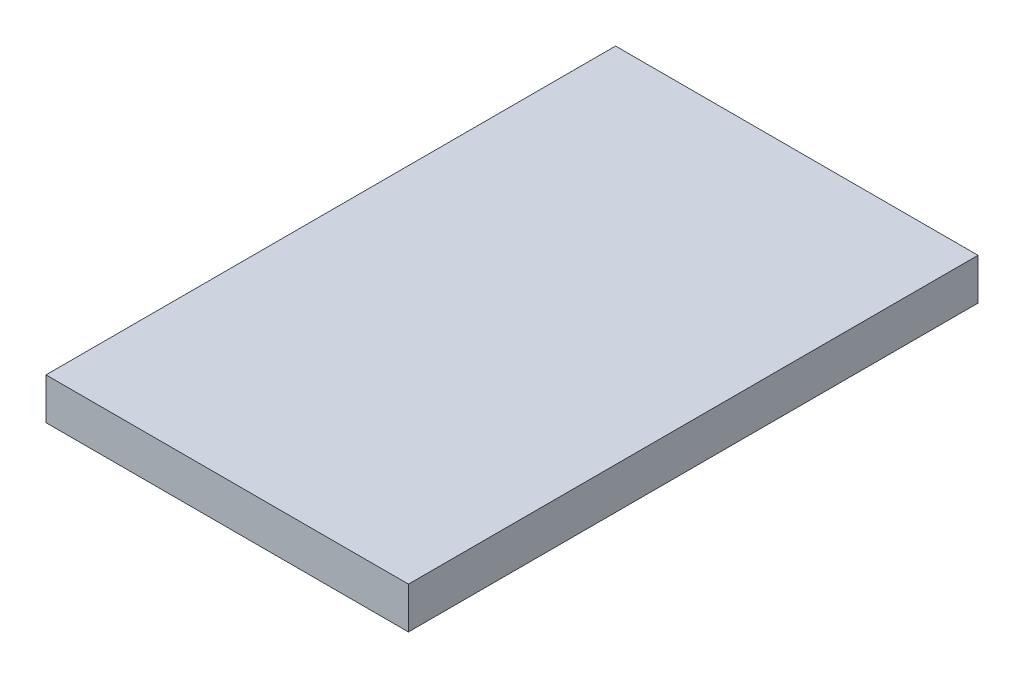
ISO-10303-21;
HEADER;
FILE_DESCRIPTION(('STEP AP214'),'2;1');
FILE_NAME('part.step','',(''),(''),'','','');
FILE_SCHEMA(('AUTOMOTIVE_DESIGN { 1 0 10303 214 1 1 1 1 }'));
ENDSEC;
DATA;
#1=APPLICATION_CONTEXT('core data for automotive mechanical design processes');
#2=APPLICATION_PROTOCOL_DEFINITION('international standard','automotive_design',2000,#1);
#3=PRODUCT_CONTEXT('',#1,'mechanical');
#4=PRODUCT('Part','Part','',(#3));
#5=PRODUCT_RELATED_PRODUCT_CATEGORY('part','',(#4));
#6=PRODUCT_DEFINITION_FORMATION('','',#4);
#7=PRODUCT_DEFINITION_CONTEXT('part definition',#1,'design');
#8=PRODUCT_DEFINITION('design','',#6,#7);
#9=PRODUCT_DEFINITION_SHAPE('','',#8);
#10=(LENGTH_UNIT() NAMED_UNIT(*) SI_UNIT(.MILLI.,.METRE.));
#11=(NAMED_UNIT(*) PLANE_ANGLE_UNIT() SI_UNIT($,.RADIAN.));
#12=(NAMED_UNIT(*) SI_UNIT($,.STERADIAN.) SOLID_ANGLE_UNIT());
#13=UNCERTAINTY_MEASURE_WITH_UNIT(LENGTH_MEASURE(1.E-05),#10,'distance_accuracy_value','');
#14=(GEOMETRIC_REPRESENTATION_CONTEXT(3) GLOBAL_UNCERTAINTY_ASSIGNED_CONTEXT((#13)) GLOBAL_UNIT_ASSIGNED_CONTEXT((#10,
#11,#12)) REPRESENTATION_CONTEXT('',''));
#15=CARTESIAN_POINT('',(0.,0.,0.));
#16=DIRECTION('',(0.,0.,1.));
#17=DIRECTION('',(1.,0.,0.));
#18=AXIS2_PLACEMENT_3D('',#15,#16,#17);
#19=CARTESIAN_POINT('',(0.,4.,0.));
#20=DIRECTION('',(1.,0.,0.));
#21=DIRECTION('',(0.,0.,-1.));
#22=AXIS2_PLACEMENT_3D('',#19,#20,#21);
#23=PLANE('',#22);
#24=DIRECTION('',(0.,0.,1.));
#25=VECTOR('',#24,1.);
#26=CARTESIAN_POINT('',(0.,0.,0.));
#27=LINE('',#26,#25);
#28=CARTESIAN_POINT('',(0.,0.,0.));
#29=VERTEX_POINT('',#28);
#30=CARTESIAN_POINT('',(0.,0.,55.));
#31=VERTEX_POINT('',#30);
#32=EDGE_CURVE('E96',#29,#31,#27,.T.);
#33=ORIENTED_EDGE('',*,*,#32,.T.);
#34=DIRECTION('',(0.,-1.,0.));
#35=VECTOR('',#34,1.);
#36=CARTESIAN_POINT('',(0.,4.,55.));
#37=LINE('',#36,#35);
#38=CARTESIAN_POINT('',(0.,4.,55.));
#39=VERTEX_POINT('',#38);
#40=EDGE_CURVE('E11',#39,#31,#37,.T.);
#41=ORIENTED_EDGE('',*,*,#40,.F.);
#42=DIRECTION('',(0.,0.,1.));
#43=VECTOR('',#42,1.);
#44=CARTESIAN_POINT('',(0.,4.,0.));
#45=LINE('',#44,#43);
#46=CARTESIAN_POINT('',(0.,4.,0.));
#47=VERTEX_POINT('',#46);
#48=EDGE_CURVE('E84',#47,#39,#45,.T.);
#49=ORIENTED_EDGE('',*,*,#48,.F.);
#50=DIRECTION('',(0.,-1.,0.));
#51=VECTOR('',#50,1.);
#52=CARTESIAN_POINT('',(0.,4.,0.));
#53=LINE('',#52,#51);
#54=EDGE_CURVE('E92',#47,#29,#53,.T.);
#55=ORIENTED_EDGE('',*,*,#54,.T.);
#56=EDGE_LOOP('',(#33,#41,#49,#55));
#57=FACE_BOUND('',#56,.T.);
#58=ADVANCED_FACE('F33',(#57),#23,.F.);
#59=CARTESIAN_POINT('',(0.,4.,55.));
#60=DIRECTION('',(0.,0.,-1.));
#61=DIRECTION('',(-1.,0.,0.));
#62=AXIS2_PLACEMENT_3D('',#59,#60,#61);
#63=PLANE('',#62);
#64=DIRECTION('',(1.,0.,0.));
#65=VECTOR('',#64,1.);
#66=CARTESIAN_POINT('',(0.,0.,55.));
#67=LINE('',#66,#65);
#68=CARTESIAN_POINT('',(35.,0.,55.));
#69=VERTEX_POINT('',#68);
#70=EDGE_CURVE('E88',#31,#69,#67,.T.);
#71=ORIENTED_EDGE('',*,*,#70,.T.);
#72=DIRECTION('',(0.,-1.,0.));
#73=VECTOR('',#72,1.);
#74=CARTESIAN_POINT('',(35.,4.,55.));
#75=LINE('',#74,#73);
#76=CARTESIAN_POINT('',(35.,4.,55.));
#77=VERTEX_POINT('',#76);
#78=EDGE_CURVE('E41',#77,#69,#75,.T.);
#79=ORIENTED_EDGE('',*,*,#78,.F.);
#80=DIRECTION('',(1.,0.,0.));
#81=VECTOR('',#80,1.);
#82=CARTESIAN_POINT('',(0.,4.,55.));
#83=LINE('',#82,#81);
#84=EDGE_CURVE('E79',#39,#77,#83,.T.);
#85=ORIENTED_EDGE('',*,*,#84,.F.);
#86=ORIENTED_EDGE('',*,*,#40,.T.);
#87=EDGE_LOOP('',(#71,#79,#85,#86));
#88=FACE_BOUND('',#87,.T.);
#89=ADVANCED_FACE('F87',(#88),#63,.F.);
#90=CARTESIAN_POINT('',(35.,4.,0.));
#91=DIRECTION('',(-1.,0.,0.));
#92=DIRECTION('',(0.,0.,1.));
#93=AXIS2_PLACEMENT_3D('',#90,#91,#92);
#94=PLANE('',#93);
#95=DIRECTION('',(0.,0.,-1.));
#96=VECTOR('',#95,1.);
#97=CARTESIAN_POINT('',(35.,0.,0.));
#98=LINE('',#97,#96);
#99=CARTESIAN_POINT('',(35.,0.,0.));
#100=VERTEX_POINT('',#99);
#101=EDGE_CURVE('E66',#69,#100,#98,.T.);
#102=ORIENTED_EDGE('',*,*,#101,.T.);
#103=DIRECTION('',(0.,-1.,0.));
#104=VECTOR('',#103,1.);
#105=CARTESIAN_POINT('',(35.,4.,0.));
#106=LINE('',#105,#104);
#107=CARTESIAN_POINT('',(35.,4.,0.));
#108=VERTEX_POINT('',#107);
#109=EDGE_CURVE('E89',#108,#100,#106,.T.);
#110=ORIENTED_EDGE('',*,*,#109,.F.);
#111=DIRECTION('',(0.,0.,-1.));
#112=VECTOR('',#111,1.);
#113=CARTESIAN_POINT('',(35.,4.,0.));
#114=LINE('',#113,#112);
#115=EDGE_CURVE('E82',#77,#108,#114,.T.);
#116=ORIENTED_EDGE('',*,*,#115,.F.);
#117=ORIENTED_EDGE('',*,*,#78,.T.);
#118=EDGE_LOOP('',(#102,#110,#116,#117));
#119=FACE_BOUND('',#118,.T.);
#120=ADVANCED_FACE('F90',(#119),#94,.F.);
#121=CARTESIAN_POINT('',(0.,4.,0.));
#122=DIRECTION('',(0.,0.,1.));
#123=DIRECTION('',(1.,0.,0.));
#124=AXIS2_PLACEMENT_3D('',#121,#122,#123);
#125=PLANE('',#124);
#126=DIRECTION('',(-1.,0.,0.));
#127=VECTOR('',#126,1.);
#128=CARTESIAN_POINT('',(0.,0.,0.));
#129=LINE('',#128,#127);
#130=EDGE_CURVE('E72',#100,#29,#129,.T.);
#131=ORIENTED_EDGE('',*,*,#130,.T.);
#132=ORIENTED_EDGE('',*,*,#54,.F.);
#133=DIRECTION('',(-1.,0.,0.));
#134=VECTOR('',#133,1.);
#135=CARTESIAN_POINT('',(0.,4.,0.));
#136=LINE('',#135,#134);
#137=EDGE_CURVE('E49',#108,#47,#136,.T.);
#138=ORIENTED_EDGE('',*,*,#137,.F.);
#139=ORIENTED_EDGE('',*,*,#109,.T.);
#140=EDGE_LOOP('',(#131,#132,#138,#139));
#141=FACE_BOUND('',#140,.T.);
#142=ADVANCED_FACE('F103',(#141),#125,.F.);
#143=CARTESIAN_POINT('',(0.,4.,0.));
#144=DIRECTION('',(0.,1.,0.));
#145=DIRECTION('',(0.,0.,1.));
#146=AXIS2_PLACEMENT_3D('',#143,#144,#145);
#147=PLANE('',#146);
#148=ORIENTED_EDGE('',*,*,#48,.T.);
#149=ORIENTED_EDGE('',*,*,#84,.T.);
#150=ORIENTED_EDGE('',*,*,#115,.T.);
#151=ORIENTED_EDGE('',*,*,#137,.T.);
#152=EDGE_LOOP('',(#148,#149,#150,#151));
#153=FACE_BOUND('',#152,.T.);
#154=ADVANCED_FACE('F80',(#153),#147,.T.);
#155=CARTESIAN_POINT('',(0.,0.,0.));
#156=DIRECTION('',(0.,1.,0.));
#157=DIRECTION('',(0.,0.,1.));
#158=AXIS2_PLACEMENT_3D('',#155,#156,#157);
#159=PLANE('',#158);
#160=ORIENTED_EDGE('',*,*,#32,.F.);
#161=ORIENTED_EDGE('',*,*,#130,.F.);
#162=ORIENTED_EDGE('',*,*,#101,.F.);
#163=ORIENTED_EDGE('',*,*,#70,.F.);
#164=EDGE_LOOP('',(#160,#161,#162,#163));
#165=FACE_BOUND('',#164,.T.);
#166=ADVANCED_FACE('F106',(#165),#159,.F.);
#167=CLOSED_SHELL('',(#58,#89,#120,#142,#154,#166));
#168=MANIFOLD_SOLID_BREP('B2',#167);
#169=ADVANCED_BREP_SHAPE_REPRESENTATION('',(#18,#168),#14);
#170=SHAPE_DEFINITION_REPRESENTATION(#9,#169);
ENDSEC;
END-ISO-10303-21;
